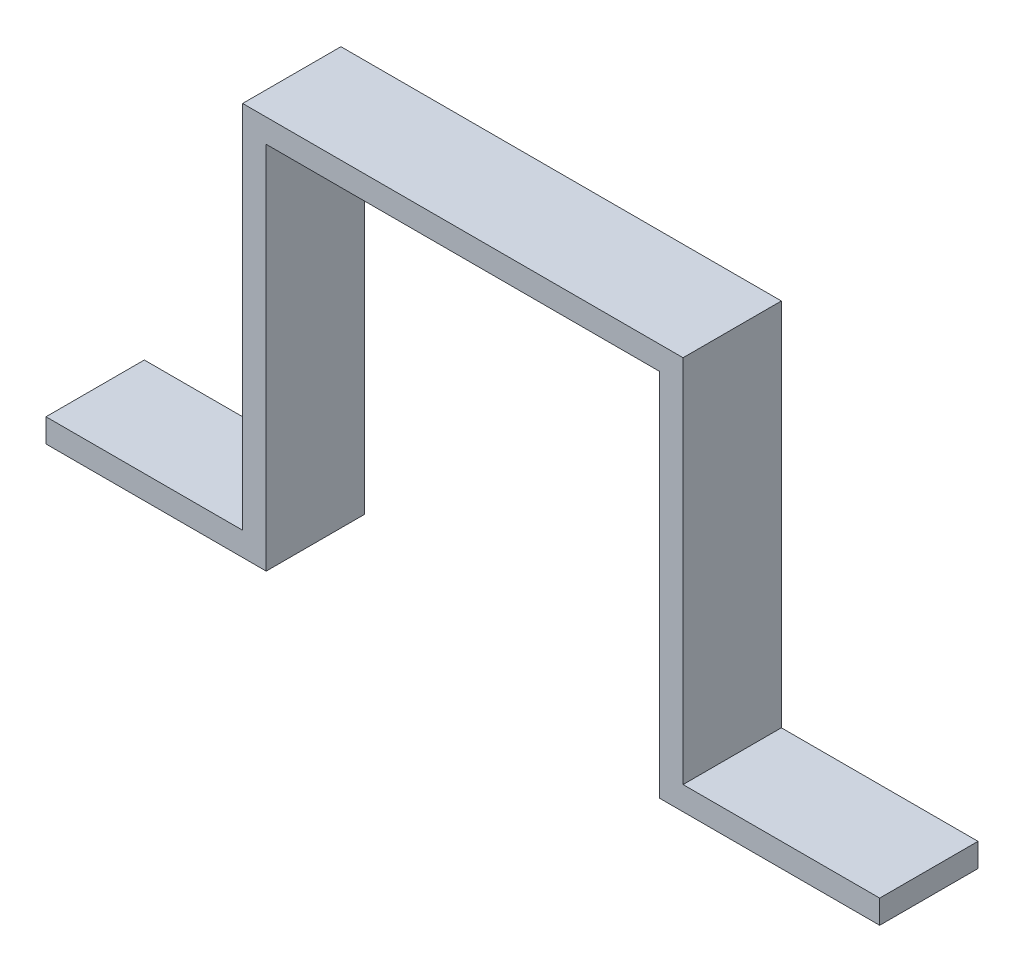
ISO-10303-21;
HEADER;
FILE_DESCRIPTION(('STEP AP214'),'2;1');
FILE_NAME('part.step','',(''),(''),'','','');
FILE_SCHEMA(('AUTOMOTIVE_DESIGN { 1 0 10303 214 1 1 1 1 }'));
ENDSEC;
DATA;
#1=APPLICATION_CONTEXT('core data for automotive mechanical design processes');
#2=APPLICATION_PROTOCOL_DEFINITION('international standard','automotive_design',2000,#1);
#3=PRODUCT_CONTEXT('',#1,'mechanical');
#4=PRODUCT('Part','Part','',(#3));
#5=PRODUCT_RELATED_PRODUCT_CATEGORY('part','',(#4));
#6=PRODUCT_DEFINITION_FORMATION('','',#4);
#7=PRODUCT_DEFINITION_CONTEXT('part definition',#1,'design');
#8=PRODUCT_DEFINITION('design','',#6,#7);
#9=PRODUCT_DEFINITION_SHAPE('','',#8);
#10=(LENGTH_UNIT() NAMED_UNIT(*) SI_UNIT(.MILLI.,.METRE.));
#11=(NAMED_UNIT(*) PLANE_ANGLE_UNIT() SI_UNIT($,.RADIAN.));
#12=(NAMED_UNIT(*) SI_UNIT($,.STERADIAN.) SOLID_ANGLE_UNIT());
#13=UNCERTAINTY_MEASURE_WITH_UNIT(LENGTH_MEASURE(1.E-05),#10,'distance_accuracy_value','');
#14=(GEOMETRIC_REPRESENTATION_CONTEXT(3) GLOBAL_UNCERTAINTY_ASSIGNED_CONTEXT((#13)) GLOBAL_UNIT_ASSIGNED_CONTEXT((#10,
#11,#12)) REPRESENTATION_CONTEXT('',''));
#15=CARTESIAN_POINT('',(0.,0.,0.));
#16=DIRECTION('',(0.,0.,1.));
#17=DIRECTION('',(1.,0.,0.));
#18=AXIS2_PLACEMENT_3D('',#15,#16,#17);
#19=CARTESIAN_POINT('',(-50.,0.,12.5));
#20=DIRECTION('',(0.,1.,0.));
#21=DIRECTION('',(0.,0.,1.));
#22=AXIS2_PLACEMENT_3D('',#19,#20,#21);
#23=PLANE('',#22);
#24=DIRECTION('',(1.,0.,0.));
#25=VECTOR('',#24,1.);
#26=CARTESIAN_POINT('',(-50.,0.,-12.5));
#27=LINE('',#26,#25);
#28=CARTESIAN_POINT('',(-106.,0.,-12.5));
#29=VERTEX_POINT('',#28);
#30=CARTESIAN_POINT('',(-50.,0.,-12.5));
#31=VERTEX_POINT('',#30);
#32=EDGE_CURVE('E159',#29,#31,#27,.T.);
#33=ORIENTED_EDGE('',*,*,#32,.T.);
#34=DIRECTION('',(0.,0.,-1.));
#35=VECTOR('',#34,1.);
#36=CARTESIAN_POINT('',(-50.,0.,12.5));
#37=LINE('',#36,#35);
#38=CARTESIAN_POINT('',(-50.,0.,12.5));
#39=VERTEX_POINT('',#38);
#40=EDGE_CURVE('E11',#39,#31,#37,.T.);
#41=ORIENTED_EDGE('',*,*,#40,.F.);
#42=DIRECTION('',(1.,0.,0.));
#43=VECTOR('',#42,1.);
#44=CARTESIAN_POINT('',(-50.,0.,12.5));
#45=LINE('',#44,#43);
#46=CARTESIAN_POINT('',(-106.,0.,12.5));
#47=VERTEX_POINT('',#46);
#48=EDGE_CURVE('E181',#47,#39,#45,.T.);
#49=ORIENTED_EDGE('',*,*,#48,.F.);
#50=DIRECTION('',(0.,0.,-1.));
#51=VECTOR('',#50,1.);
#52=CARTESIAN_POINT('',(-106.,0.,12.5));
#53=LINE('',#52,#51);
#54=EDGE_CURVE('E155',#47,#29,#53,.T.);
#55=ORIENTED_EDGE('',*,*,#54,.T.);
#56=EDGE_LOOP('',(#33,#41,#49,#55));
#57=FACE_BOUND('',#56,.T.);
#58=ADVANCED_FACE('F39',(#57),#23,.F.);
#59=CARTESIAN_POINT('',(-50.,94.,12.5));
#60=DIRECTION('',(-1.,0.,0.));
#61=DIRECTION('',(0.,0.,1.));
#62=AXIS2_PLACEMENT_3D('',#59,#60,#61);
#63=PLANE('',#62);
#64=DIRECTION('',(0.,1.,0.));
#65=VECTOR('',#64,1.);
#66=CARTESIAN_POINT('',(-50.,94.,-12.5));
#67=LINE('',#66,#65);
#68=CARTESIAN_POINT('',(-50.,94.,-12.5));
#69=VERTEX_POINT('',#68);
#70=EDGE_CURVE('E162',#31,#69,#67,.T.);
#71=ORIENTED_EDGE('',*,*,#70,.T.);
#72=DIRECTION('',(0.,0.,-1.));
#73=VECTOR('',#72,1.);
#74=CARTESIAN_POINT('',(-50.,94.,12.5));
#75=LINE('',#74,#73);
#76=CARTESIAN_POINT('',(-50.,94.,12.5));
#77=VERTEX_POINT('',#76);
#78=EDGE_CURVE('E50',#77,#69,#75,.T.);
#79=ORIENTED_EDGE('',*,*,#78,.F.);
#80=DIRECTION('',(0.,1.,0.));
#81=VECTOR('',#80,1.);
#82=CARTESIAN_POINT('',(-50.,94.,12.5));
#83=LINE('',#82,#81);
#84=EDGE_CURVE('E110',#39,#77,#83,.T.);
#85=ORIENTED_EDGE('',*,*,#84,.F.);
#86=ORIENTED_EDGE('',*,*,#40,.T.);
#87=EDGE_LOOP('',(#71,#79,#85,#86));
#88=FACE_BOUND('',#87,.T.);
#89=ADVANCED_FACE('F260',(#88),#63,.F.);
#90=CARTESIAN_POINT('',(50.,94.,12.5));
#91=DIRECTION('',(0.,1.,0.));
#92=DIRECTION('',(0.,0.,1.));
#93=AXIS2_PLACEMENT_3D('',#90,#91,#92);
#94=PLANE('',#93);
#95=DIRECTION('',(1.,0.,0.));
#96=VECTOR('',#95,1.);
#97=CARTESIAN_POINT('',(50.,94.,-12.5));
#98=LINE('',#97,#96);
#99=CARTESIAN_POINT('',(50.,94.,-12.5));
#100=VERTEX_POINT('',#99);
#101=EDGE_CURVE('E163',#69,#100,#98,.T.);
#102=ORIENTED_EDGE('',*,*,#101,.T.);
#103=DIRECTION('',(0.,0.,-1.));
#104=VECTOR('',#103,1.);
#105=CARTESIAN_POINT('',(50.,94.,12.5));
#106=LINE('',#105,#104);
#107=CARTESIAN_POINT('',(50.,94.,12.5));
#108=VERTEX_POINT('',#107);
#109=EDGE_CURVE('E200',#108,#100,#106,.T.);
#110=ORIENTED_EDGE('',*,*,#109,.F.);
#111=DIRECTION('',(1.,0.,0.));
#112=VECTOR('',#111,1.);
#113=CARTESIAN_POINT('',(50.,94.,12.5));
#114=LINE('',#113,#112);
#115=EDGE_CURVE('E209',#77,#108,#114,.T.);
#116=ORIENTED_EDGE('',*,*,#115,.F.);
#117=ORIENTED_EDGE('',*,*,#78,.T.);
#118=EDGE_LOOP('',(#102,#110,#116,#117));
#119=FACE_BOUND('',#118,.T.);
#120=ADVANCED_FACE('F206',(#119),#94,.F.);
#121=CARTESIAN_POINT('',(50.,0.,12.5));
#122=DIRECTION('',(1.,0.,0.));
#123=DIRECTION('',(0.,0.,-1.));
#124=AXIS2_PLACEMENT_3D('',#121,#122,#123);
#125=PLANE('',#124);
#126=DIRECTION('',(0.,-1.,0.));
#127=VECTOR('',#126,1.);
#128=CARTESIAN_POINT('',(50.,0.,-12.5));
#129=LINE('',#128,#127);
#130=CARTESIAN_POINT('',(50.,0.,-12.5));
#131=VERTEX_POINT('',#130);
#132=EDGE_CURVE('E168',#100,#131,#129,.T.);
#133=ORIENTED_EDGE('',*,*,#132,.T.);
#134=DIRECTION('',(0.,0.,-1.));
#135=VECTOR('',#134,1.);
#136=CARTESIAN_POINT('',(50.,0.,12.5));
#137=LINE('',#136,#135);
#138=CARTESIAN_POINT('',(50.,0.,12.5));
#139=VERTEX_POINT('',#138);
#140=EDGE_CURVE('E197',#139,#131,#137,.T.);
#141=ORIENTED_EDGE('',*,*,#140,.F.);
#142=DIRECTION('',(0.,-1.,0.));
#143=VECTOR('',#142,1.);
#144=CARTESIAN_POINT('',(50.,0.,12.5));
#145=LINE('',#144,#143);
#146=EDGE_CURVE('E226',#108,#139,#145,.T.);
#147=ORIENTED_EDGE('',*,*,#146,.F.);
#148=ORIENTED_EDGE('',*,*,#109,.T.);
#149=EDGE_LOOP('',(#133,#141,#147,#148));
#150=FACE_BOUND('',#149,.T.);
#151=ADVANCED_FACE('F220',(#150),#125,.F.);
#152=CARTESIAN_POINT('',(106.,0.,12.5));
#153=DIRECTION('',(0.,1.,0.));
#154=DIRECTION('',(0.,0.,1.));
#155=AXIS2_PLACEMENT_3D('',#152,#153,#154);
#156=PLANE('',#155);
#157=DIRECTION('',(1.,0.,0.));
#158=VECTOR('',#157,1.);
#159=CARTESIAN_POINT('',(106.,0.,-12.5));
#160=LINE('',#159,#158);
#161=CARTESIAN_POINT('',(106.,0.,-12.5));
#162=VERTEX_POINT('',#161);
#163=EDGE_CURVE('E166',#131,#162,#160,.T.);
#164=ORIENTED_EDGE('',*,*,#163,.T.);
#165=DIRECTION('',(0.,0.,-1.));
#166=VECTOR('',#165,1.);
#167=CARTESIAN_POINT('',(106.,0.,12.5));
#168=LINE('',#167,#166);
#169=CARTESIAN_POINT('',(106.,0.,12.5));
#170=VERTEX_POINT('',#169);
#171=EDGE_CURVE('E191',#170,#162,#168,.T.);
#172=ORIENTED_EDGE('',*,*,#171,.F.);
#173=DIRECTION('',(1.,0.,0.));
#174=VECTOR('',#173,1.);
#175=CARTESIAN_POINT('',(106.,0.,12.5));
#176=LINE('',#175,#174);
#177=EDGE_CURVE('E223',#139,#170,#176,.T.);
#178=ORIENTED_EDGE('',*,*,#177,.F.);
#179=ORIENTED_EDGE('',*,*,#140,.T.);
#180=EDGE_LOOP('',(#164,#172,#178,#179));
#181=FACE_BOUND('',#180,.T.);
#182=ADVANCED_FACE('F221',(#181),#156,.F.);
#183=CARTESIAN_POINT('',(106.,6.,12.5));
#184=DIRECTION('',(-1.,0.,0.));
#185=DIRECTION('',(0.,0.,1.));
#186=AXIS2_PLACEMENT_3D('',#183,#184,#185);
#187=PLANE('',#186);
#188=DIRECTION('',(0.,1.,0.));
#189=VECTOR('',#188,1.);
#190=CARTESIAN_POINT('',(106.,6.,-12.5));
#191=LINE('',#190,#189);
#192=CARTESIAN_POINT('',(106.,6.,-12.5));
#193=VERTEX_POINT('',#192);
#194=EDGE_CURVE('E169',#162,#193,#191,.T.);
#195=ORIENTED_EDGE('',*,*,#194,.T.);
#196=DIRECTION('',(0.,0.,-1.));
#197=VECTOR('',#196,1.);
#198=CARTESIAN_POINT('',(106.,6.,12.5));
#199=LINE('',#198,#197);
#200=CARTESIAN_POINT('',(106.,6.,12.5));
#201=VERTEX_POINT('',#200);
#202=EDGE_CURVE('E192',#201,#193,#199,.T.);
#203=ORIENTED_EDGE('',*,*,#202,.F.);
#204=DIRECTION('',(0.,1.,0.));
#205=VECTOR('',#204,1.);
#206=CARTESIAN_POINT('',(106.,6.,12.5));
#207=LINE('',#206,#205);
#208=EDGE_CURVE('E224',#170,#201,#207,.T.);
#209=ORIENTED_EDGE('',*,*,#208,.F.);
#210=ORIENTED_EDGE('',*,*,#171,.T.);
#211=EDGE_LOOP('',(#195,#203,#209,#210));
#212=FACE_BOUND('',#211,.T.);
#213=ADVANCED_FACE('F275',(#212),#187,.F.);
#214=CARTESIAN_POINT('',(56.,6.,12.5));
#215=DIRECTION('',(0.,-1.,0.));
#216=DIRECTION('',(0.,0.,-1.));
#217=AXIS2_PLACEMENT_3D('',#214,#215,#216);
#218=PLANE('',#217);
#219=DIRECTION('',(-1.,0.,0.));
#220=VECTOR('',#219,1.);
#221=CARTESIAN_POINT('',(56.,6.,-12.5));
#222=LINE('',#221,#220);
#223=CARTESIAN_POINT('',(56.,6.,-12.5));
#224=VERTEX_POINT('',#223);
#225=EDGE_CURVE('E175',#193,#224,#222,.T.);
#226=ORIENTED_EDGE('',*,*,#225,.T.);
#227=DIRECTION('',(0.,0.,-1.));
#228=VECTOR('',#227,1.);
#229=CARTESIAN_POINT('',(56.,6.,12.5));
#230=LINE('',#229,#228);
#231=CARTESIAN_POINT('',(56.,6.,12.5));
#232=VERTEX_POINT('',#231);
#233=EDGE_CURVE('E187',#232,#224,#230,.T.);
#234=ORIENTED_EDGE('',*,*,#233,.F.);
#235=DIRECTION('',(-1.,0.,0.));
#236=VECTOR('',#235,1.);
#237=CARTESIAN_POINT('',(56.,6.,12.5));
#238=LINE('',#237,#236);
#239=EDGE_CURVE('E228',#201,#232,#238,.T.);
#240=ORIENTED_EDGE('',*,*,#239,.F.);
#241=ORIENTED_EDGE('',*,*,#202,.T.);
#242=EDGE_LOOP('',(#226,#234,#240,#241));
#243=FACE_BOUND('',#242,.T.);
#244=ADVANCED_FACE('F274',(#243),#218,.F.);
#245=CARTESIAN_POINT('',(56.,100.,12.5));
#246=DIRECTION('',(-1.,0.,0.));
#247=DIRECTION('',(0.,0.,1.));
#248=AXIS2_PLACEMENT_3D('',#245,#246,#247);
#249=PLANE('',#248);
#250=DIRECTION('',(0.,1.,0.));
#251=VECTOR('',#250,1.);
#252=CARTESIAN_POINT('',(56.,100.,-12.5));
#253=LINE('',#252,#251);
#254=CARTESIAN_POINT('',(56.,100.,-12.5));
#255=VERTEX_POINT('',#254);
#256=EDGE_CURVE('E174',#224,#255,#253,.T.);
#257=ORIENTED_EDGE('',*,*,#256,.T.);
#258=DIRECTION('',(0.,0.,-1.));
#259=VECTOR('',#258,1.);
#260=CARTESIAN_POINT('',(56.,100.,12.5));
#261=LINE('',#260,#259);
#262=CARTESIAN_POINT('',(56.,100.,12.5));
#263=VERTEX_POINT('',#262);
#264=EDGE_CURVE('E184',#263,#255,#261,.T.);
#265=ORIENTED_EDGE('',*,*,#264,.F.);
#266=DIRECTION('',(0.,1.,0.));
#267=VECTOR('',#266,1.);
#268=CARTESIAN_POINT('',(56.,100.,12.5));
#269=LINE('',#268,#267);
#270=EDGE_CURVE('E233',#232,#263,#269,.T.);
#271=ORIENTED_EDGE('',*,*,#270,.F.);
#272=ORIENTED_EDGE('',*,*,#233,.T.);
#273=EDGE_LOOP('',(#257,#265,#271,#272));
#274=FACE_BOUND('',#273,.T.);
#275=ADVANCED_FACE('F238',(#274),#249,.F.);
#276=CARTESIAN_POINT('',(-56.,100.,12.5));
#277=DIRECTION('',(0.,-1.,0.));
#278=DIRECTION('',(0.,0.,-1.));
#279=AXIS2_PLACEMENT_3D('',#276,#277,#278);
#280=PLANE('',#279);
#281=DIRECTION('',(-1.,0.,0.));
#282=VECTOR('',#281,1.);
#283=CARTESIAN_POINT('',(-56.,100.,-12.5));
#284=LINE('',#283,#282);
#285=CARTESIAN_POINT('',(-56.,100.,-12.5));
#286=VERTEX_POINT('',#285);
#287=EDGE_CURVE('E176',#255,#286,#284,.T.);
#288=ORIENTED_EDGE('',*,*,#287,.T.);
#289=DIRECTION('',(0.,0.,-1.));
#290=VECTOR('',#289,1.);
#291=CARTESIAN_POINT('',(-56.,100.,12.5));
#292=LINE('',#291,#290);
#293=CARTESIAN_POINT('',(-56.,100.,12.5));
#294=VERTEX_POINT('',#293);
#295=EDGE_CURVE('E148',#294,#286,#292,.T.);
#296=ORIENTED_EDGE('',*,*,#295,.F.);
#297=DIRECTION('',(-1.,0.,0.));
#298=VECTOR('',#297,1.);
#299=CARTESIAN_POINT('',(-56.,100.,12.5));
#300=LINE('',#299,#298);
#301=EDGE_CURVE('E141',#263,#294,#300,.T.);
#302=ORIENTED_EDGE('',*,*,#301,.F.);
#303=ORIENTED_EDGE('',*,*,#264,.T.);
#304=EDGE_LOOP('',(#288,#296,#302,#303));
#305=FACE_BOUND('',#304,.T.);
#306=ADVANCED_FACE('F243',(#305),#280,.F.);
#307=CARTESIAN_POINT('',(-56.,6.,12.5));
#308=DIRECTION('',(1.,0.,0.));
#309=DIRECTION('',(0.,0.,-1.));
#310=AXIS2_PLACEMENT_3D('',#307,#308,#309);
#311=PLANE('',#310);
#312=DIRECTION('',(0.,-1.,0.));
#313=VECTOR('',#312,1.);
#314=CARTESIAN_POINT('',(-56.,6.,-12.5));
#315=LINE('',#314,#313);
#316=CARTESIAN_POINT('',(-56.,6.,-12.5));
#317=VERTEX_POINT('',#316);
#318=EDGE_CURVE('E146',#286,#317,#315,.T.);
#319=ORIENTED_EDGE('',*,*,#318,.T.);
#320=DIRECTION('',(0.,0.,-1.));
#321=VECTOR('',#320,1.);
#322=CARTESIAN_POINT('',(-56.,6.,12.5));
#323=LINE('',#322,#321);
#324=CARTESIAN_POINT('',(-56.,6.,12.5));
#325=VERTEX_POINT('',#324);
#326=EDGE_CURVE('E147',#325,#317,#323,.T.);
#327=ORIENTED_EDGE('',*,*,#326,.F.);
#328=DIRECTION('',(0.,-1.,0.));
#329=VECTOR('',#328,1.);
#330=CARTESIAN_POINT('',(-56.,6.,12.5));
#331=LINE('',#330,#329);
#332=EDGE_CURVE('E134',#294,#325,#331,.T.);
#333=ORIENTED_EDGE('',*,*,#332,.F.);
#334=ORIENTED_EDGE('',*,*,#295,.T.);
#335=EDGE_LOOP('',(#319,#327,#333,#334));
#336=FACE_BOUND('',#335,.T.);
#337=ADVANCED_FACE('F150',(#336),#311,.F.);
#338=CARTESIAN_POINT('',(-106.,6.,12.5));
#339=DIRECTION('',(0.,-1.,0.));
#340=DIRECTION('',(0.,0.,-1.));
#341=AXIS2_PLACEMENT_3D('',#338,#339,#340);
#342=PLANE('',#341);
#343=DIRECTION('',(-1.,0.,0.));
#344=VECTOR('',#343,1.);
#345=CARTESIAN_POINT('',(-106.,6.,-12.5));
#346=LINE('',#345,#344);
#347=CARTESIAN_POINT('',(-106.,6.,-12.5));
#348=VERTEX_POINT('',#347);
#349=EDGE_CURVE('E96',#317,#348,#346,.T.);
#350=ORIENTED_EDGE('',*,*,#349,.T.);
#351=DIRECTION('',(0.,0.,-1.));
#352=VECTOR('',#351,1.);
#353=CARTESIAN_POINT('',(-106.,6.,12.5));
#354=LINE('',#353,#352);
#355=CARTESIAN_POINT('',(-106.,6.,12.5));
#356=VERTEX_POINT('',#355);
#357=EDGE_CURVE('E151',#356,#348,#354,.T.);
#358=ORIENTED_EDGE('',*,*,#357,.F.);
#359=DIRECTION('',(-1.,0.,0.));
#360=VECTOR('',#359,1.);
#361=CARTESIAN_POINT('',(-106.,6.,12.5));
#362=LINE('',#361,#360);
#363=EDGE_CURVE('E137',#325,#356,#362,.T.);
#364=ORIENTED_EDGE('',*,*,#363,.F.);
#365=ORIENTED_EDGE('',*,*,#326,.T.);
#366=EDGE_LOOP('',(#350,#358,#364,#365));
#367=FACE_BOUND('',#366,.T.);
#368=ADVANCED_FACE('F154',(#367),#342,.F.);
#369=CARTESIAN_POINT('',(-106.,0.,12.5));
#370=DIRECTION('',(1.,0.,0.));
#371=DIRECTION('',(0.,0.,-1.));
#372=AXIS2_PLACEMENT_3D('',#369,#370,#371);
#373=PLANE('',#372);
#374=DIRECTION('',(0.,-1.,0.));
#375=VECTOR('',#374,1.);
#376=CARTESIAN_POINT('',(-106.,0.,-12.5));
#377=LINE('',#376,#375);
#378=EDGE_CURVE('E105',#348,#29,#377,.T.);
#379=ORIENTED_EDGE('',*,*,#378,.T.);
#380=ORIENTED_EDGE('',*,*,#54,.F.);
#381=DIRECTION('',(0.,-1.,0.));
#382=VECTOR('',#381,1.);
#383=CARTESIAN_POINT('',(-106.,0.,12.5));
#384=LINE('',#383,#382);
#385=EDGE_CURVE('E54',#356,#47,#384,.T.);
#386=ORIENTED_EDGE('',*,*,#385,.F.);
#387=ORIENTED_EDGE('',*,*,#357,.T.);
#388=EDGE_LOOP('',(#379,#380,#386,#387));
#389=FACE_BOUND('',#388,.T.);
#390=ADVANCED_FACE('F246',(#389),#373,.F.);
#391=CARTESIAN_POINT('',(0.,0.,12.5));
#392=DIRECTION('',(0.,0.,-1.));
#393=DIRECTION('',(-1.,0.,0.));
#394=AXIS2_PLACEMENT_3D('',#391,#392,#393);
#395=PLANE('',#394);
#396=ORIENTED_EDGE('',*,*,#48,.T.);
#397=ORIENTED_EDGE('',*,*,#84,.T.);
#398=ORIENTED_EDGE('',*,*,#115,.T.);
#399=ORIENTED_EDGE('',*,*,#146,.T.);
#400=ORIENTED_EDGE('',*,*,#177,.T.);
#401=ORIENTED_EDGE('',*,*,#208,.T.);
#402=ORIENTED_EDGE('',*,*,#239,.T.);
#403=ORIENTED_EDGE('',*,*,#270,.T.);
#404=ORIENTED_EDGE('',*,*,#301,.T.);
#405=ORIENTED_EDGE('',*,*,#332,.T.);
#406=ORIENTED_EDGE('',*,*,#363,.T.);
#407=ORIENTED_EDGE('',*,*,#385,.T.);
#408=EDGE_LOOP('',(#396,#397,#398,#399,#400,#401,#402,#403,#404,#405,#406,#407));
#409=FACE_BOUND('',#408,.T.);
#410=ADVANCED_FACE('F140',(#409),#395,.F.);
#411=CARTESIAN_POINT('',(0.,0.,-12.5));
#412=DIRECTION('',(0.,0.,-1.));
#413=DIRECTION('',(-1.,0.,0.));
#414=AXIS2_PLACEMENT_3D('',#411,#412,#413);
#415=PLANE('',#414);
#416=ORIENTED_EDGE('',*,*,#32,.F.);
#417=ORIENTED_EDGE('',*,*,#378,.F.);
#418=ORIENTED_EDGE('',*,*,#349,.F.);
#419=ORIENTED_EDGE('',*,*,#318,.F.);
#420=ORIENTED_EDGE('',*,*,#287,.F.);
#421=ORIENTED_EDGE('',*,*,#256,.F.);
#422=ORIENTED_EDGE('',*,*,#225,.F.);
#423=ORIENTED_EDGE('',*,*,#194,.F.);
#424=ORIENTED_EDGE('',*,*,#163,.F.);
#425=ORIENTED_EDGE('',*,*,#132,.F.);
#426=ORIENTED_EDGE('',*,*,#101,.F.);
#427=ORIENTED_EDGE('',*,*,#70,.F.);
#428=EDGE_LOOP('',(#416,#417,#418,#419,#420,#421,#422,#423,#424,#425,#426,#427));
#429=FACE_BOUND('',#428,.T.);
#430=ADVANCED_FACE('F212',(#429),#415,.T.);
#431=CLOSED_SHELL('',(#58,#89,#120,#151,#182,#213,#244,#275,#306,#337,#368,#390,#410,#430));
#432=MANIFOLD_SOLID_BREP('B2',#431);
#433=ADVANCED_BREP_SHAPE_REPRESENTATION('',(#18,#432),#14);
#434=SHAPE_DEFINITION_REPRESENTATION(#9,#433);
ENDSEC;
END-ISO-10303-21;
